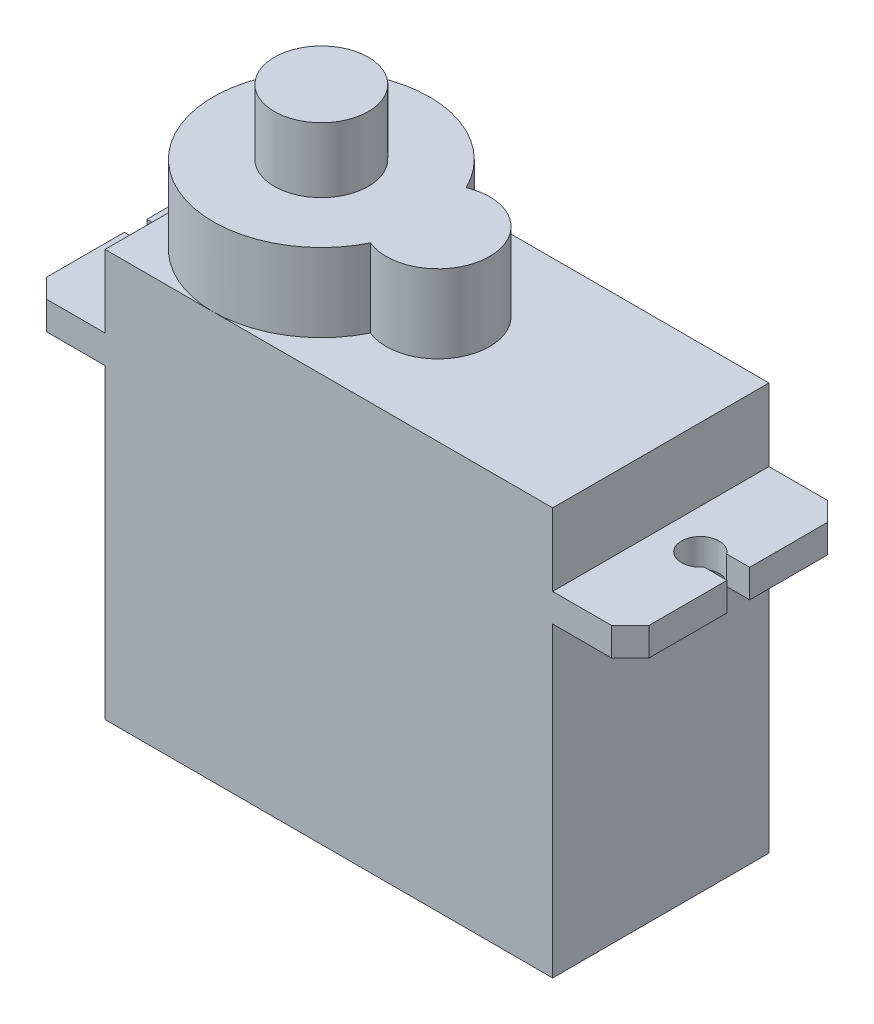
ISO-10303-21;
HEADER;
FILE_DESCRIPTION(('STEP AP214'),'2;1');
FILE_NAME('part.step','',(''),(''),'','','');
FILE_SCHEMA(('AUTOMOTIVE_DESIGN { 1 0 10303 214 1 1 1 1 }'));
ENDSEC;
DATA;
#1=APPLICATION_CONTEXT('core data for automotive mechanical design processes');
#2=APPLICATION_PROTOCOL_DEFINITION('international standard','automotive_design',2000,#1);
#3=PRODUCT_CONTEXT('',#1,'mechanical');
#4=PRODUCT('Part','Part','',(#3));
#5=PRODUCT_RELATED_PRODUCT_CATEGORY('part','',(#4));
#6=PRODUCT_DEFINITION_FORMATION('','',#4);
#7=PRODUCT_DEFINITION_CONTEXT('part definition',#1,'design');
#8=PRODUCT_DEFINITION('design','',#6,#7);
#9=PRODUCT_DEFINITION_SHAPE('','',#8);
#10=(LENGTH_UNIT() NAMED_UNIT(*) SI_UNIT(.MILLI.,.METRE.));
#11=(NAMED_UNIT(*) PLANE_ANGLE_UNIT() SI_UNIT($,.RADIAN.));
#12=(NAMED_UNIT(*) SI_UNIT($,.STERADIAN.) SOLID_ANGLE_UNIT());
#13=UNCERTAINTY_MEASURE_WITH_UNIT(LENGTH_MEASURE(1.E-05),#10,'distance_accuracy_value','');
#14=(GEOMETRIC_REPRESENTATION_CONTEXT(3) GLOBAL_UNCERTAINTY_ASSIGNED_CONTEXT((#13)) GLOBAL_UNIT_ASSIGNED_CONTEXT((#10,
#11,#12)) REPRESENTATION_CONTEXT('',''));
#15=CARTESIAN_POINT('',(0.,0.,0.));
#16=DIRECTION('',(0.,0.,1.));
#17=DIRECTION('',(1.,0.,0.));
#18=AXIS2_PLACEMENT_3D('',#15,#16,#17);
#19=CARTESIAN_POINT('',(-16.025,69.6507342064749,-5.75));
#20=DIRECTION('',(-1.,0.,0.));
#21=DIRECTION('',(0.,0.,1.));
#22=AXIS2_PLACEMENT_3D('',#19,#20,#21);
#23=PLANE('',#22);
#24=DIRECTION('',(0.,0.,-1.));
#25=VECTOR('',#24,1.);
#26=CARTESIAN_POINT('',(-16.025,16.3,-5.75));
#27=LINE('',#26,#25);
#28=CARTESIAN_POINT('',(-16.025,16.3,-0.6));
#29=VERTEX_POINT('',#28);
#30=CARTESIAN_POINT('',(-16.025,16.3,-4.75));
#31=VERTEX_POINT('',#30);
#32=EDGE_CURVE('E313',#29,#31,#27,.T.);
#33=ORIENTED_EDGE('',*,*,#32,.F.);
#34=DIRECTION('',(0.,1.,0.));
#35=VECTOR('',#34,1.);
#36=CARTESIAN_POINT('',(-16.025,-0.001000000000001,-0.6));
#37=LINE('',#36,#35);
#38=CARTESIAN_POINT('',(-16.025,17.8,-0.6));
#39=VERTEX_POINT('',#38);
#40=EDGE_CURVE('E62',#29,#39,#37,.T.);
#41=ORIENTED_EDGE('',*,*,#40,.T.);
#42=DIRECTION('',(0.,0.,1.));
#43=VECTOR('',#42,1.);
#44=CARTESIAN_POINT('',(-16.025,17.8,-5.75));
#45=LINE('',#44,#43);
#46=CARTESIAN_POINT('',(-16.025,17.8,-4.75));
#47=VERTEX_POINT('',#46);
#48=EDGE_CURVE('E345',#47,#39,#45,.T.);
#49=ORIENTED_EDGE('',*,*,#48,.F.);
#50=DIRECTION('',(0.,-1.,0.));
#51=VECTOR('',#50,1.);
#52=CARTESIAN_POINT('',(-16.025,16.3,-4.75));
#53=LINE('',#52,#51);
#54=EDGE_CURVE('E480',#47,#31,#53,.T.);
#55=ORIENTED_EDGE('',*,*,#54,.T.);
#56=EDGE_LOOP('',(#33,#41,#49,#55));
#57=FACE_BOUND('',#56,.T.);
#58=ADVANCED_FACE('F46',(#57),#23,.T.);
#59=CARTESIAN_POINT('',(16.025,69.6507342064749,-5.75));
#60=DIRECTION('',(1.,0.,0.));
#61=DIRECTION('',(0.,0.,-1.));
#62=AXIS2_PLACEMENT_3D('',#59,#60,#61);
#63=PLANE('',#62);
#64=DIRECTION('',(0.,0.,1.));
#65=VECTOR('',#64,1.);
#66=CARTESIAN_POINT('',(16.025,16.3,-5.75));
#67=LINE('',#66,#65);
#68=CARTESIAN_POINT('',(16.025,16.3,0.6));
#69=VERTEX_POINT('',#68);
#70=CARTESIAN_POINT('',(16.025,16.3,4.75));
#71=VERTEX_POINT('',#70);
#72=EDGE_CURVE('E357',#69,#71,#67,.T.);
#73=ORIENTED_EDGE('',*,*,#72,.F.);
#74=DIRECTION('',(0.,1.,0.));
#75=VECTOR('',#74,1.);
#76=CARTESIAN_POINT('',(16.025,-0.001000000000001,0.6));
#77=LINE('',#76,#75);
#78=CARTESIAN_POINT('',(16.025,17.8,0.6));
#79=VERTEX_POINT('',#78);
#80=EDGE_CURVE('E296',#69,#79,#77,.T.);
#81=ORIENTED_EDGE('',*,*,#80,.T.);
#82=DIRECTION('',(0.,0.,-1.));
#83=VECTOR('',#82,1.);
#84=CARTESIAN_POINT('',(16.025,17.8,-5.75));
#85=LINE('',#84,#83);
#86=CARTESIAN_POINT('',(16.025,17.8,4.75));
#87=VERTEX_POINT('',#86);
#88=EDGE_CURVE('E335',#87,#79,#85,.T.);
#89=ORIENTED_EDGE('',*,*,#88,.F.);
#90=DIRECTION('',(0.,-1.,0.));
#91=VECTOR('',#90,1.);
#92=CARTESIAN_POINT('',(16.025,16.3,4.75));
#93=LINE('',#92,#91);
#94=EDGE_CURVE('E455',#87,#71,#93,.T.);
#95=ORIENTED_EDGE('',*,*,#94,.T.);
#96=EDGE_LOOP('',(#73,#81,#89,#95));
#97=FACE_BOUND('',#96,.T.);
#98=ADVANCED_FACE('F591',(#97),#63,.T.);
#99=CARTESIAN_POINT('',(0.,21.65,0.));
#100=DIRECTION('',(0.,-1.,0.));
#101=DIRECTION('',(0.,0.,-1.));
#102=AXIS2_PLACEMENT_3D('',#99,#100,#101);
#103=PLANE('',#102);
#104=CARTESIAN_POINT('',(-6.15,21.65,0.));
#105=DIRECTION('',(0.,1.,0.));
#106=DIRECTION('',(0.,0.,1.));
#107=AXIS2_PLACEMENT_3D('',#104,#105,#106);
#108=CIRCLE('',#107,5.75);
#109=CARTESIAN_POINT('',(-0.993548387096772,21.65,-2.54430870056833));
#110=VERTEX_POINT('',#109);
#111=CARTESIAN_POINT('',(-6.15,21.65,-5.75));
#112=VERTEX_POINT('',#111);
#113=EDGE_CURVE('E308',#110,#112,#108,.T.);
#114=ORIENTED_EDGE('',*,*,#113,.F.);
#115=CARTESIAN_POINT('',(0.0500000000000014,21.65,0.));
#116=DIRECTION('',(0.,1.,0.));
#117=DIRECTION('',(0.,0.,1.));
#118=AXIS2_PLACEMENT_3D('',#115,#116,#117);
#119=CIRCLE('',#118,2.75);
#120=CARTESIAN_POINT('',(-0.993548387096772,21.65,2.54430870056833));
#121=VERTEX_POINT('',#120);
#122=EDGE_CURVE('E318',#121,#110,#119,.T.);
#123=ORIENTED_EDGE('',*,*,#122,.F.);
#124=CARTESIAN_POINT('',(-6.15,21.65,5.75));
#125=VERTEX_POINT('',#124);
#126=EDGE_CURVE('E320',#125,#121,#108,.T.);
#127=ORIENTED_EDGE('',*,*,#126,.F.);
#128=DIRECTION('',(1.,0.,0.));
#129=VECTOR('',#128,1.);
#130=CARTESIAN_POINT('',(-11.9,21.65,5.75));
#131=LINE('',#130,#129);
#132=CARTESIAN_POINT('',(11.9,21.65,5.75));
#133=VERTEX_POINT('',#132);
#134=EDGE_CURVE('E401',#125,#133,#131,.T.);
#135=ORIENTED_EDGE('',*,*,#134,.T.);
#136=DIRECTION('',(0.,0.,-1.));
#137=VECTOR('',#136,1.);
#138=CARTESIAN_POINT('',(11.9,21.65,5.75));
#139=LINE('',#138,#137);
#140=CARTESIAN_POINT('',(11.9,21.65,-5.75));
#141=VERTEX_POINT('',#140);
#142=EDGE_CURVE('E386',#133,#141,#139,.T.);
#143=ORIENTED_EDGE('',*,*,#142,.T.);
#144=DIRECTION('',(-1.,0.,0.));
#145=VECTOR('',#144,1.);
#146=CARTESIAN_POINT('',(-11.9,21.65,-5.75));
#147=LINE('',#146,#145);
#148=EDGE_CURVE('E392',#141,#112,#147,.T.);
#149=ORIENTED_EDGE('',*,*,#148,.T.);
#150=EDGE_LOOP('',(#114,#123,#127,#135,#143,#149));
#151=FACE_BOUND('',#150,.T.);
#152=ADVANCED_FACE('F556',(#151),#103,.F.);
#153=CARTESIAN_POINT('',(-11.9,21.65,0.));
#154=VERTEX_POINT('',#153);
#155=EDGE_CURVE('E319',#112,#154,#108,.T.);
#156=ORIENTED_EDGE('',*,*,#155,.F.);
#157=CARTESIAN_POINT('',(-11.9,21.65,-5.75));
#158=VERTEX_POINT('',#157);
#159=EDGE_CURVE('E390',#112,#158,#147,.T.);
#160=ORIENTED_EDGE('',*,*,#159,.T.);
#161=DIRECTION('',(0.,0.,1.));
#162=VECTOR('',#161,1.);
#163=CARTESIAN_POINT('',(-11.9,21.65,5.75));
#164=LINE('',#163,#162);
#165=EDGE_CURVE('E397',#158,#154,#164,.T.);
#166=ORIENTED_EDGE('',*,*,#165,.T.);
#167=EDGE_LOOP('',(#156,#160,#166));
#168=FACE_BOUND('',#167,.T.);
#169=ADVANCED_FACE('F548',(#168),#103,.F.);
#170=CARTESIAN_POINT('',(11.9,21.65,5.75));
#171=DIRECTION('',(-1.,0.,0.));
#172=DIRECTION('',(0.,0.,1.));
#173=AXIS2_PLACEMENT_3D('',#170,#171,#172);
#174=PLANE('',#173);
#175=DIRECTION('',(0.,0.,1.));
#176=VECTOR('',#175,1.);
#177=CARTESIAN_POINT('',(11.9,17.8,5.75));
#178=LINE('',#177,#176);
#179=CARTESIAN_POINT('',(11.9,17.8,-5.75));
#180=VERTEX_POINT('',#179);
#181=CARTESIAN_POINT('',(11.9,17.8,5.75));
#182=VERTEX_POINT('',#181);
#183=EDGE_CURVE('E373',#180,#182,#178,.T.);
#184=ORIENTED_EDGE('',*,*,#183,.F.);
#185=DIRECTION('',(0.,-1.,0.));
#186=VECTOR('',#185,1.);
#187=CARTESIAN_POINT('',(11.9,21.65,-5.75));
#188=LINE('',#187,#186);
#189=EDGE_CURVE('E434',#141,#180,#188,.T.);
#190=ORIENTED_EDGE('',*,*,#189,.F.);
#191=ORIENTED_EDGE('',*,*,#142,.F.);
#192=DIRECTION('',(0.,-1.,0.));
#193=VECTOR('',#192,1.);
#194=CARTESIAN_POINT('',(11.9,21.65,5.75));
#195=LINE('',#194,#193);
#196=EDGE_CURVE('E421',#133,#182,#195,.T.);
#197=ORIENTED_EDGE('',*,*,#196,.T.);
#198=EDGE_LOOP('',(#184,#190,#191,#197));
#199=FACE_BOUND('',#198,.T.);
#200=ADVANCED_FACE('F563',(#199),#174,.F.);
#201=CARTESIAN_POINT('',(-11.9,21.65,5.75));
#202=DIRECTION('',(1.,0.,0.));
#203=DIRECTION('',(0.,0.,-1.));
#204=AXIS2_PLACEMENT_3D('',#201,#202,#203);
#205=PLANE('',#204);
#206=DIRECTION('',(0.,0.,-1.));
#207=VECTOR('',#206,1.);
#208=CARTESIAN_POINT('',(-11.9,17.8,5.75));
#209=LINE('',#208,#207);
#210=CARTESIAN_POINT('',(-11.9,17.8,5.75));
#211=VERTEX_POINT('',#210);
#212=CARTESIAN_POINT('',(-11.9,17.8,-5.75));
#213=VERTEX_POINT('',#212);
#214=EDGE_CURVE('E369',#211,#213,#209,.T.);
#215=ORIENTED_EDGE('',*,*,#214,.F.);
#216=DIRECTION('',(0.,-1.,0.));
#217=VECTOR('',#216,1.);
#218=CARTESIAN_POINT('',(-11.9,21.65,5.75));
#219=LINE('',#218,#217);
#220=CARTESIAN_POINT('',(-11.9,21.65,5.75));
#221=VERTEX_POINT('',#220);
#222=EDGE_CURVE('E425',#221,#211,#219,.T.);
#223=ORIENTED_EDGE('',*,*,#222,.F.);
#224=EDGE_CURVE('E396',#154,#221,#164,.T.);
#225=ORIENTED_EDGE('',*,*,#224,.F.);
#226=ORIENTED_EDGE('',*,*,#165,.F.);
#227=DIRECTION('',(0.,-1.,0.));
#228=VECTOR('',#227,1.);
#229=CARTESIAN_POINT('',(-11.9,21.65,-5.75));
#230=LINE('',#229,#228);
#231=EDGE_CURVE('E430',#158,#213,#230,.T.);
#232=ORIENTED_EDGE('',*,*,#231,.T.);
#233=EDGE_LOOP('',(#215,#223,#225,#226,#232));
#234=FACE_BOUND('',#233,.T.);
#235=ADVANCED_FACE('F617',(#234),#205,.F.);
#236=CARTESIAN_POINT('',(11.9,16.3,-5.75));
#237=VERTEX_POINT('',#236);
#238=CARTESIAN_POINT('',(11.9,0.,-5.75));
#239=VERTEX_POINT('',#238);
#240=EDGE_CURVE('E433',#237,#239,#188,.T.);
#241=ORIENTED_EDGE('',*,*,#240,.F.);
#242=DIRECTION('',(0.,0.,1.));
#243=VECTOR('',#242,1.);
#244=CARTESIAN_POINT('',(11.9,16.3,5.75));
#245=LINE('',#244,#243);
#246=CARTESIAN_POINT('',(11.9,16.3,5.75));
#247=VERTEX_POINT('',#246);
#248=EDGE_CURVE('E381',#237,#247,#245,.T.);
#249=ORIENTED_EDGE('',*,*,#248,.T.);
#250=CARTESIAN_POINT('',(11.9,0.,5.75));
#251=VERTEX_POINT('',#250);
#252=EDGE_CURVE('E406',#247,#251,#195,.T.);
#253=ORIENTED_EDGE('',*,*,#252,.T.);
#254=DIRECTION('',(0.,0.,-1.));
#255=VECTOR('',#254,1.);
#256=CARTESIAN_POINT('',(11.9,0.,5.75));
#257=LINE('',#256,#255);
#258=EDGE_CURVE('E385',#251,#239,#257,.T.);
#259=ORIENTED_EDGE('',*,*,#258,.T.);
#260=EDGE_LOOP('',(#241,#249,#253,#259));
#261=FACE_BOUND('',#260,.T.);
#262=ADVANCED_FACE('F603',(#261),#174,.F.);
#263=CARTESIAN_POINT('',(-11.9,21.65,-5.75));
#264=DIRECTION('',(0.,0.,1.));
#265=DIRECTION('',(1.,0.,0.));
#266=AXIS2_PLACEMENT_3D('',#263,#264,#265);
#267=PLANE('',#266);
#268=DIRECTION('',(-1.,0.,0.));
#269=VECTOR('',#268,1.);
#270=CARTESIAN_POINT('',(16.025,17.8,-5.75));
#271=LINE('',#270,#269);
#272=CARTESIAN_POINT('',(15.025,17.8,-5.75));
#273=VERTEX_POINT('',#272);
#274=EDGE_CURVE('E366',#273,#180,#271,.T.);
#275=ORIENTED_EDGE('',*,*,#274,.F.);
#276=DIRECTION('',(0.,-1.,0.));
#277=VECTOR('',#276,1.);
#278=CARTESIAN_POINT('',(15.025,16.3,-5.75));
#279=LINE('',#278,#277);
#280=CARTESIAN_POINT('',(15.025,16.3,-5.75));
#281=VERTEX_POINT('',#280);
#282=EDGE_CURVE('E445',#273,#281,#279,.T.);
#283=ORIENTED_EDGE('',*,*,#282,.T.);
#284=DIRECTION('',(1.,0.,0.));
#285=VECTOR('',#284,1.);
#286=CARTESIAN_POINT('',(16.025,16.3,-5.75));
#287=LINE('',#286,#285);
#288=EDGE_CURVE('E353',#237,#281,#287,.T.);
#289=ORIENTED_EDGE('',*,*,#288,.F.);
#290=ORIENTED_EDGE('',*,*,#240,.T.);
#291=DIRECTION('',(-1.,0.,0.));
#292=VECTOR('',#291,1.);
#293=CARTESIAN_POINT('',(-11.9,0.,-5.75));
#294=LINE('',#293,#292);
#295=CARTESIAN_POINT('',(-11.9,0.,-5.75));
#296=VERTEX_POINT('',#295);
#297=EDGE_CURVE('E410',#239,#296,#294,.T.);
#298=ORIENTED_EDGE('',*,*,#297,.T.);
#299=CARTESIAN_POINT('',(-11.9,16.3,-5.75));
#300=VERTEX_POINT('',#299);
#301=EDGE_CURVE('E429',#300,#296,#230,.T.);
#302=ORIENTED_EDGE('',*,*,#301,.F.);
#303=CARTESIAN_POINT('',(-15.025,16.3,-5.75));
#304=VERTEX_POINT('',#303);
#305=EDGE_CURVE('E354',#304,#300,#287,.T.);
#306=ORIENTED_EDGE('',*,*,#305,.F.);
#307=DIRECTION('',(0.,1.,0.));
#308=VECTOR('',#307,1.);
#309=CARTESIAN_POINT('',(-15.025,17.8,-5.75));
#310=LINE('',#309,#308);
#311=CARTESIAN_POINT('',(-15.025,17.8,-5.75));
#312=VERTEX_POINT('',#311);
#313=EDGE_CURVE('E442',#304,#312,#310,.T.);
#314=ORIENTED_EDGE('',*,*,#313,.T.);
#315=EDGE_CURVE('E349',#213,#312,#271,.T.);
#316=ORIENTED_EDGE('',*,*,#315,.F.);
#317=ORIENTED_EDGE('',*,*,#231,.F.);
#318=ORIENTED_EDGE('',*,*,#159,.F.);
#319=ORIENTED_EDGE('',*,*,#148,.F.);
#320=ORIENTED_EDGE('',*,*,#189,.T.);
#321=EDGE_LOOP('',(#275,#283,#289,#290,#298,#302,#306,#314,#316,#317,#318,#319,#320));
#322=FACE_BOUND('',#321,.T.);
#323=ADVANCED_FACE('F553',(#322),#267,.F.);
#324=CARTESIAN_POINT('',(-11.9,16.3,5.75));
#325=VERTEX_POINT('',#324);
#326=CARTESIAN_POINT('',(-11.9,0.,5.75));
#327=VERTEX_POINT('',#326);
#328=EDGE_CURVE('E424',#325,#327,#219,.T.);
#329=ORIENTED_EDGE('',*,*,#328,.F.);
#330=DIRECTION('',(0.,0.,-1.));
#331=VECTOR('',#330,1.);
#332=CARTESIAN_POINT('',(-11.9,16.3,5.75));
#333=LINE('',#332,#331);
#334=EDGE_CURVE('E377',#325,#300,#333,.T.);
#335=ORIENTED_EDGE('',*,*,#334,.T.);
#336=ORIENTED_EDGE('',*,*,#301,.T.);
#337=DIRECTION('',(0.,0.,1.));
#338=VECTOR('',#337,1.);
#339=CARTESIAN_POINT('',(-11.9,0.,5.75));
#340=LINE('',#339,#338);
#341=EDGE_CURVE('E414',#296,#327,#340,.T.);
#342=ORIENTED_EDGE('',*,*,#341,.T.);
#343=EDGE_LOOP('',(#329,#335,#336,#342));
#344=FACE_BOUND('',#343,.T.);
#345=ADVANCED_FACE('F610',(#344),#205,.F.);
#346=CARTESIAN_POINT('',(-11.9,21.65,5.75));
#347=DIRECTION('',(0.,0.,-1.));
#348=DIRECTION('',(-1.,0.,0.));
#349=AXIS2_PLACEMENT_3D('',#346,#347,#348);
#350=PLANE('',#349);
#351=DIRECTION('',(-1.,0.,0.));
#352=VECTOR('',#351,1.);
#353=CARTESIAN_POINT('',(16.025,16.3,5.75));
#354=LINE('',#353,#352);
#355=CARTESIAN_POINT('',(15.025,16.3,5.75));
#356=VERTEX_POINT('',#355);
#357=EDGE_CURVE('E363',#356,#247,#354,.T.);
#358=ORIENTED_EDGE('',*,*,#357,.F.);
#359=DIRECTION('',(0.,1.,0.));
#360=VECTOR('',#359,1.);
#361=CARTESIAN_POINT('',(15.025,17.8,5.75));
#362=LINE('',#361,#360);
#363=CARTESIAN_POINT('',(15.025,17.8,5.75));
#364=VERTEX_POINT('',#363);
#365=EDGE_CURVE('E473',#356,#364,#362,.T.);
#366=ORIENTED_EDGE('',*,*,#365,.T.);
#367=DIRECTION('',(1.,0.,0.));
#368=VECTOR('',#367,1.);
#369=CARTESIAN_POINT('',(16.025,17.8,5.75));
#370=LINE('',#369,#368);
#371=EDGE_CURVE('E339',#182,#364,#370,.T.);
#372=ORIENTED_EDGE('',*,*,#371,.F.);
#373=ORIENTED_EDGE('',*,*,#196,.F.);
#374=ORIENTED_EDGE('',*,*,#134,.F.);
#375=EDGE_CURVE('E402',#221,#125,#131,.T.);
#376=ORIENTED_EDGE('',*,*,#375,.F.);
#377=ORIENTED_EDGE('',*,*,#222,.T.);
#378=CARTESIAN_POINT('',(-15.025,17.8,5.75));
#379=VERTEX_POINT('',#378);
#380=EDGE_CURVE('E341',#379,#211,#370,.T.);
#381=ORIENTED_EDGE('',*,*,#380,.F.);
#382=DIRECTION('',(0.,-1.,0.));
#383=VECTOR('',#382,1.);
#384=CARTESIAN_POINT('',(-15.025,16.3,5.75));
#385=LINE('',#384,#383);
#386=CARTESIAN_POINT('',(-15.025,16.3,5.75));
#387=VERTEX_POINT('',#386);
#388=EDGE_CURVE('E469',#379,#387,#385,.T.);
#389=ORIENTED_EDGE('',*,*,#388,.T.);
#390=EDGE_CURVE('E362',#325,#387,#354,.T.);
#391=ORIENTED_EDGE('',*,*,#390,.F.);
#392=ORIENTED_EDGE('',*,*,#328,.T.);
#393=DIRECTION('',(1.,0.,0.));
#394=VECTOR('',#393,1.);
#395=CARTESIAN_POINT('',(-11.9,0.,5.75));
#396=LINE('',#395,#394);
#397=EDGE_CURVE('E391',#327,#251,#396,.T.);
#398=ORIENTED_EDGE('',*,*,#397,.T.);
#399=ORIENTED_EDGE('',*,*,#252,.F.);
#400=EDGE_LOOP('',(#358,#366,#372,#373,#374,#376,#377,#381,#389,#391,#392,#398,#399));
#401=FACE_BOUND('',#400,.T.);
#402=ADVANCED_FACE('F502',(#401),#350,.F.);
#403=EDGE_CURVE('E539',#154,#125,#108,.T.);
#404=ORIENTED_EDGE('',*,*,#403,.F.);
#405=ORIENTED_EDGE('',*,*,#224,.T.);
#406=ORIENTED_EDGE('',*,*,#375,.T.);
#407=EDGE_LOOP('',(#404,#405,#406));
#408=FACE_BOUND('',#407,.T.);
#409=ADVANCED_FACE('F620',(#408),#103,.F.);
#410=CARTESIAN_POINT('',(0.,0.,0.));
#411=DIRECTION('',(0.,-1.,0.));
#412=DIRECTION('',(0.,0.,-1.));
#413=AXIS2_PLACEMENT_3D('',#410,#411,#412);
#414=PLANE('',#413);
#415=ORIENTED_EDGE('',*,*,#258,.F.);
#416=ORIENTED_EDGE('',*,*,#397,.F.);
#417=ORIENTED_EDGE('',*,*,#341,.F.);
#418=ORIENTED_EDGE('',*,*,#297,.F.);
#419=EDGE_LOOP('',(#415,#416,#417,#418));
#420=FACE_BOUND('',#419,.T.);
#421=ADVANCED_FACE('F608',(#420),#414,.T.);
#422=DIRECTION('',(0.,1.,0.));
#423=VECTOR('',#422,1.);
#424=CARTESIAN_POINT('',(-16.025,-0.001000000000001,0.6));
#425=LINE('',#424,#423);
#426=CARTESIAN_POINT('',(-16.025,16.3,0.6));
#427=VERTEX_POINT('',#426);
#428=CARTESIAN_POINT('',(-16.025,17.8,0.6));
#429=VERTEX_POINT('',#428);
#430=EDGE_CURVE('E266',#427,#429,#425,.T.);
#431=ORIENTED_EDGE('',*,*,#430,.F.);
#432=CARTESIAN_POINT('',(-16.025,16.3,4.74999999999999));
#433=VERTEX_POINT('',#432);
#434=EDGE_CURVE('E350',#433,#427,#27,.T.);
#435=ORIENTED_EDGE('',*,*,#434,.F.);
#436=DIRECTION('',(0.,1.,0.));
#437=VECTOR('',#436,1.);
#438=CARTESIAN_POINT('',(-16.025,17.8,4.74999999999999));
#439=LINE('',#438,#437);
#440=CARTESIAN_POINT('',(-16.025,17.8,4.74999999999999));
#441=VERTEX_POINT('',#440);
#442=EDGE_CURVE('E476',#433,#441,#439,.T.);
#443=ORIENTED_EDGE('',*,*,#442,.T.);
#444=EDGE_CURVE('E344',#429,#441,#45,.T.);
#445=ORIENTED_EDGE('',*,*,#444,.F.);
#446=EDGE_LOOP('',(#431,#435,#443,#445));
#447=FACE_BOUND('',#446,.T.);
#448=ADVANCED_FACE('F511',(#447),#23,.T.);
#449=CARTESIAN_POINT('',(0.,17.8,0.));
#450=DIRECTION('',(0.,-1.,0.));
#451=DIRECTION('',(0.,0.,-1.));
#452=AXIS2_PLACEMENT_3D('',#449,#450,#451);
#453=PLANE('',#452);
#454=CARTESIAN_POINT('',(-14.,17.8,0.));
#455=DIRECTION('',(0.,-1.,0.));
#456=DIRECTION('',(0.,0.,1.));
#457=AXIS2_PLACEMENT_3D('',#454,#455,#456);
#458=CIRCLE('',#457,1.);
#459=CARTESIAN_POINT('',(-14.8,17.8,-0.6));
#460=VERTEX_POINT('',#459);
#461=CARTESIAN_POINT('',(-14.8,17.8,0.600000000000001));
#462=VERTEX_POINT('',#461);
#463=EDGE_CURVE('E235',#460,#462,#458,.T.);
#464=ORIENTED_EDGE('',*,*,#463,.T.);
#465=DIRECTION('',(1.,0.,0.));
#466=VECTOR('',#465,1.);
#467=CARTESIAN_POINT('',(0.,17.8,0.600000000000001));
#468=LINE('',#467,#466);
#469=EDGE_CURVE('E238',#429,#462,#468,.T.);
#470=ORIENTED_EDGE('',*,*,#469,.F.);
#471=ORIENTED_EDGE('',*,*,#444,.T.);
#472=DIRECTION('',(0.707106781186548,0.,0.707106781186547));
#473=VECTOR('',#472,1.);
#474=CARTESIAN_POINT('',(-15.025,17.8,5.75));
#475=LINE('',#474,#473);
#476=EDGE_CURVE('E55',#441,#379,#475,.T.);
#477=ORIENTED_EDGE('',*,*,#476,.T.);
#478=ORIENTED_EDGE('',*,*,#380,.T.);
#479=ORIENTED_EDGE('',*,*,#214,.T.);
#480=ORIENTED_EDGE('',*,*,#315,.T.);
#481=DIRECTION('',(-0.707106781186548,0.,0.707106781186547));
#482=VECTOR('',#481,1.);
#483=CARTESIAN_POINT('',(-16.025,17.8,-4.75));
#484=LINE('',#483,#482);
#485=EDGE_CURVE('E12',#312,#47,#484,.T.);
#486=ORIENTED_EDGE('',*,*,#485,.T.);
#487=ORIENTED_EDGE('',*,*,#48,.T.);
#488=DIRECTION('',(1.,0.,0.));
#489=VECTOR('',#488,1.);
#490=CARTESIAN_POINT('',(0.,17.8,-0.599999999999999));
#491=LINE('',#490,#489);
#492=EDGE_CURVE('E258',#39,#460,#491,.T.);
#493=ORIENTED_EDGE('',*,*,#492,.T.);
#494=EDGE_LOOP('',(#464,#470,#471,#477,#478,#479,#480,#486,#487,#493));
#495=FACE_BOUND('',#494,.T.);
#496=ADVANCED_FACE('F493',(#495),#453,.F.);
#497=CARTESIAN_POINT('',(0.,16.3,0.));
#498=DIRECTION('',(0.,-1.,0.));
#499=DIRECTION('',(0.,0.,-1.));
#500=AXIS2_PLACEMENT_3D('',#497,#498,#499);
#501=PLANE('',#500);
#502=DIRECTION('',(1.,0.,0.));
#503=VECTOR('',#502,1.);
#504=CARTESIAN_POINT('',(0.,16.3,0.600000000000001));
#505=LINE('',#504,#503);
#506=CARTESIAN_POINT('',(-14.8,16.3,0.600000000000001));
#507=VERTEX_POINT('',#506);
#508=EDGE_CURVE('E250',#427,#507,#505,.T.);
#509=ORIENTED_EDGE('',*,*,#508,.T.);
#510=CARTESIAN_POINT('',(-14.,16.3,0.));
#511=DIRECTION('',(0.,-1.,0.));
#512=DIRECTION('',(0.,0.,-1.));
#513=AXIS2_PLACEMENT_3D('',#510,#511,#512);
#514=CIRCLE('',#513,1.);
#515=CARTESIAN_POINT('',(-14.8,16.3,-0.6));
#516=VERTEX_POINT('',#515);
#517=EDGE_CURVE('E232',#516,#507,#514,.T.);
#518=ORIENTED_EDGE('',*,*,#517,.F.);
#519=DIRECTION('',(1.,0.,0.));
#520=VECTOR('',#519,1.);
#521=CARTESIAN_POINT('',(0.,16.3,-0.599999999999999));
#522=LINE('',#521,#520);
#523=EDGE_CURVE('E240',#29,#516,#522,.T.);
#524=ORIENTED_EDGE('',*,*,#523,.F.);
#525=ORIENTED_EDGE('',*,*,#32,.T.);
#526=DIRECTION('',(0.707106781186548,0.,-0.707106781186547));
#527=VECTOR('',#526,1.);
#528=CARTESIAN_POINT('',(-10.3875,16.3,-10.3875));
#529=LINE('',#528,#527);
#530=EDGE_CURVE('E487',#31,#304,#529,.T.);
#531=ORIENTED_EDGE('',*,*,#530,.T.);
#532=ORIENTED_EDGE('',*,*,#305,.T.);
#533=ORIENTED_EDGE('',*,*,#334,.F.);
#534=ORIENTED_EDGE('',*,*,#390,.T.);
#535=DIRECTION('',(-0.707106781186548,0.,-0.707106781186547));
#536=VECTOR('',#535,1.);
#537=CARTESIAN_POINT('',(-10.3875,16.3,10.3875));
#538=LINE('',#537,#536);
#539=EDGE_CURVE('E484',#387,#433,#538,.T.);
#540=ORIENTED_EDGE('',*,*,#539,.T.);
#541=ORIENTED_EDGE('',*,*,#434,.T.);
#542=EDGE_LOOP('',(#509,#518,#524,#525,#531,#532,#533,#534,#540,#541));
#543=FACE_BOUND('',#542,.T.);
#544=ADVANCED_FACE('F248',(#543),#501,.T.);
#545=DIRECTION('',(-1.,0.,0.));
#546=VECTOR('',#545,1.);
#547=CARTESIAN_POINT('',(0.,16.3,-0.599999999999999));
#548=LINE('',#547,#546);
#549=CARTESIAN_POINT('',(16.025,16.3,-0.6));
#550=VERTEX_POINT('',#549);
#551=CARTESIAN_POINT('',(14.8,16.3,-0.6));
#552=VERTEX_POINT('',#551);
#553=EDGE_CURVE('E274',#550,#552,#548,.T.);
#554=ORIENTED_EDGE('',*,*,#553,.T.);
#555=CARTESIAN_POINT('',(14.,16.3,0.));
#556=DIRECTION('',(0.,-1.,0.));
#557=DIRECTION('',(0.,0.,-1.));
#558=AXIS2_PLACEMENT_3D('',#555,#556,#557);
#559=CIRCLE('',#558,1.);
#560=CARTESIAN_POINT('',(14.8,16.3,0.6));
#561=VERTEX_POINT('',#560);
#562=EDGE_CURVE('E245',#552,#561,#559,.F.);
#563=ORIENTED_EDGE('',*,*,#562,.T.);
#564=DIRECTION('',(-1.,0.,0.));
#565=VECTOR('',#564,1.);
#566=CARTESIAN_POINT('',(0.,16.3,0.600000000000001));
#567=LINE('',#566,#565);
#568=EDGE_CURVE('E292',#69,#561,#567,.T.);
#569=ORIENTED_EDGE('',*,*,#568,.F.);
#570=ORIENTED_EDGE('',*,*,#72,.T.);
#571=DIRECTION('',(-0.707106781186548,0.,0.707106781186547));
#572=VECTOR('',#571,1.);
#573=CARTESIAN_POINT('',(10.3875,16.3,10.3875));
#574=LINE('',#573,#572);
#575=EDGE_CURVE('E449',#71,#356,#574,.T.);
#576=ORIENTED_EDGE('',*,*,#575,.T.);
#577=ORIENTED_EDGE('',*,*,#357,.T.);
#578=ORIENTED_EDGE('',*,*,#248,.F.);
#579=ORIENTED_EDGE('',*,*,#288,.T.);
#580=DIRECTION('',(0.707106781186548,0.,0.707106781186547));
#581=VECTOR('',#580,1.);
#582=CARTESIAN_POINT('',(10.3875,16.3,-10.3875));
#583=LINE('',#582,#581);
#584=CARTESIAN_POINT('',(16.025,16.3,-4.74999999999999));
#585=VERTEX_POINT('',#584);
#586=EDGE_CURVE('E452',#281,#585,#583,.T.);
#587=ORIENTED_EDGE('',*,*,#586,.T.);
#588=EDGE_CURVE('E358',#585,#550,#67,.T.);
#589=ORIENTED_EDGE('',*,*,#588,.T.);
#590=EDGE_LOOP('',(#554,#563,#569,#570,#576,#577,#578,#579,#587,#589));
#591=FACE_BOUND('',#590,.T.);
#592=ADVANCED_FACE('F573',(#591),#501,.T.);
#593=CARTESIAN_POINT('',(14.,17.8,0.));
#594=DIRECTION('',(0.,1.,0.));
#595=DIRECTION('',(0.,0.,1.));
#596=AXIS2_PLACEMENT_3D('',#593,#594,#595);
#597=CIRCLE('',#596,1.);
#598=CARTESIAN_POINT('',(14.8,17.8,-0.6));
#599=VERTEX_POINT('',#598);
#600=CARTESIAN_POINT('',(14.8,17.8,0.600000000000001));
#601=VERTEX_POINT('',#600);
#602=EDGE_CURVE('E278',#599,#601,#597,.T.);
#603=ORIENTED_EDGE('',*,*,#602,.F.);
#604=DIRECTION('',(-1.,0.,0.));
#605=VECTOR('',#604,1.);
#606=CARTESIAN_POINT('',(0.,17.8,-0.599999999999999));
#607=LINE('',#606,#605);
#608=CARTESIAN_POINT('',(16.025,17.8,-0.6));
#609=VERTEX_POINT('',#608);
#610=EDGE_CURVE('E284',#609,#599,#607,.T.);
#611=ORIENTED_EDGE('',*,*,#610,.F.);
#612=CARTESIAN_POINT('',(16.025,17.8,-4.74999999999999));
#613=VERTEX_POINT('',#612);
#614=EDGE_CURVE('E340',#609,#613,#85,.T.);
#615=ORIENTED_EDGE('',*,*,#614,.T.);
#616=DIRECTION('',(-0.707106781186548,0.,-0.707106781186547));
#617=VECTOR('',#616,1.);
#618=CARTESIAN_POINT('',(15.025,17.8,-5.75));
#619=LINE('',#618,#617);
#620=EDGE_CURVE('E466',#613,#273,#619,.T.);
#621=ORIENTED_EDGE('',*,*,#620,.T.);
#622=ORIENTED_EDGE('',*,*,#274,.T.);
#623=ORIENTED_EDGE('',*,*,#183,.T.);
#624=ORIENTED_EDGE('',*,*,#371,.T.);
#625=DIRECTION('',(0.707106781186548,0.,-0.707106781186547));
#626=VECTOR('',#625,1.);
#627=CARTESIAN_POINT('',(16.025,17.8,4.75));
#628=LINE('',#627,#626);
#629=EDGE_CURVE('E463',#364,#87,#628,.T.);
#630=ORIENTED_EDGE('',*,*,#629,.T.);
#631=ORIENTED_EDGE('',*,*,#88,.T.);
#632=DIRECTION('',(-1.,0.,0.));
#633=VECTOR('',#632,1.);
#634=CARTESIAN_POINT('',(0.,17.8,0.600000000000001));
#635=LINE('',#634,#633);
#636=EDGE_CURVE('E70',#79,#601,#635,.T.);
#637=ORIENTED_EDGE('',*,*,#636,.T.);
#638=EDGE_LOOP('',(#603,#611,#615,#621,#622,#623,#624,#630,#631,#637));
#639=FACE_BOUND('',#638,.T.);
#640=ADVANCED_FACE('F583',(#639),#453,.F.);
#641=DIRECTION('',(0.,1.,0.));
#642=VECTOR('',#641,1.);
#643=CARTESIAN_POINT('',(16.025,-0.001000000000001,-0.6));
#644=LINE('',#643,#642);
#645=EDGE_CURVE('E293',#550,#609,#644,.T.);
#646=ORIENTED_EDGE('',*,*,#645,.F.);
#647=ORIENTED_EDGE('',*,*,#588,.F.);
#648=DIRECTION('',(0.,1.,0.));
#649=VECTOR('',#648,1.);
#650=CARTESIAN_POINT('',(16.025,17.8,-4.74999999999999));
#651=LINE('',#650,#649);
#652=EDGE_CURVE('E459',#585,#613,#651,.T.);
#653=ORIENTED_EDGE('',*,*,#652,.T.);
#654=ORIENTED_EDGE('',*,*,#614,.F.);
#655=EDGE_LOOP('',(#646,#647,#653,#654));
#656=FACE_BOUND('',#655,.T.);
#657=ADVANCED_FACE('F577',(#656),#63,.T.);
#658=CARTESIAN_POINT('',(0.0500000000000014,70.2638688379446,0.));
#659=DIRECTION('',(0.,-1.,0.));
#660=DIRECTION('',(0.,0.,-1.));
#661=AXIS2_PLACEMENT_3D('',#658,#659,#660);
#662=CYLINDRICAL_SURFACE('',#661,2.75);
#663=DIRECTION('',(0.,-1.,0.));
#664=VECTOR('',#663,1.);
#665=CARTESIAN_POINT('',(-0.993548387096772,70.2638688379446,-2.54430870056833));
#666=LINE('',#665,#664);
#667=CARTESIAN_POINT('',(-0.993548387096772,25.8,-2.54430870056833));
#668=VERTEX_POINT('',#667);
#669=EDGE_CURVE('E324',#668,#110,#666,.T.);
#670=ORIENTED_EDGE('',*,*,#669,.F.);
#671=CARTESIAN_POINT('',(0.0500000000000014,25.8,0.));
#672=DIRECTION('',(0.,-1.,0.));
#673=DIRECTION('',(0.,0.,-1.));
#674=AXIS2_PLACEMENT_3D('',#671,#672,#673);
#675=CIRCLE('',#674,2.75);
#676=CARTESIAN_POINT('',(-0.993548387096772,25.8,2.54430870056833));
#677=VERTEX_POINT('',#676);
#678=EDGE_CURVE('E314',#668,#677,#675,.T.);
#679=ORIENTED_EDGE('',*,*,#678,.T.);
#680=DIRECTION('',(0.,-1.,0.));
#681=VECTOR('',#680,1.);
#682=CARTESIAN_POINT('',(-0.993548387096772,70.2638688379446,2.54430870056833));
#683=LINE('',#682,#681);
#684=EDGE_CURVE('E328',#677,#121,#683,.T.);
#685=ORIENTED_EDGE('',*,*,#684,.T.);
#686=ORIENTED_EDGE('',*,*,#122,.T.);
#687=EDGE_LOOP('',(#670,#679,#685,#686));
#688=FACE_BOUND('',#687,.T.);
#689=ADVANCED_FACE('F652',(#688),#662,.T.);
#690=CARTESIAN_POINT('',(-6.15,70.2638688379446,0.));
#691=DIRECTION('',(0.,-1.,0.));
#692=DIRECTION('',(0.,0.,-1.));
#693=AXIS2_PLACEMENT_3D('',#690,#691,#692);
#694=CYLINDRICAL_SURFACE('',#693,5.75);
#695=ORIENTED_EDGE('',*,*,#684,.F.);
#696=CARTESIAN_POINT('',(-6.15,25.8,0.));
#697=DIRECTION('',(0.,-1.,0.));
#698=DIRECTION('',(0.,0.,-1.));
#699=AXIS2_PLACEMENT_3D('',#696,#697,#698);
#700=CIRCLE('',#699,5.75);
#701=EDGE_CURVE('E309',#677,#668,#700,.T.);
#702=ORIENTED_EDGE('',*,*,#701,.T.);
#703=ORIENTED_EDGE('',*,*,#669,.T.);
#704=ORIENTED_EDGE('',*,*,#113,.T.);
#705=ORIENTED_EDGE('',*,*,#155,.T.);
#706=ORIENTED_EDGE('',*,*,#403,.T.);
#707=ORIENTED_EDGE('',*,*,#126,.T.);
#708=EDGE_LOOP('',(#695,#702,#703,#704,#705,#706,#707));
#709=FACE_BOUND('',#708,.T.);
#710=ADVANCED_FACE('F545',(#709),#694,.T.);
#711=CARTESIAN_POINT('',(0.,25.8,0.));
#712=DIRECTION('',(0.,-1.,0.));
#713=DIRECTION('',(0.,0.,-1.));
#714=AXIS2_PLACEMENT_3D('',#711,#712,#713);
#715=PLANE('',#714);
#716=CARTESIAN_POINT('',(-6.15,25.8,0.));
#717=DIRECTION('',(0.,-1.,0.));
#718=DIRECTION('',(0.,0.,-1.));
#719=AXIS2_PLACEMENT_3D('',#716,#717,#718);
#720=CIRCLE('',#719,2.5);
#721=CARTESIAN_POINT('',(-6.15,25.8,-2.5));
#722=VERTEX_POINT('',#721);
#723=EDGE_CURVE('E438',#722,#722,#720,.F.);
#724=ORIENTED_EDGE('',*,*,#723,.F.);
#725=EDGE_LOOP('',(#724));
#726=FACE_BOUND('',#725,.T.);
#727=ORIENTED_EDGE('',*,*,#678,.F.);
#728=ORIENTED_EDGE('',*,*,#701,.F.);
#729=EDGE_LOOP('',(#727,#728));
#730=FACE_BOUND('',#729,.T.);
#731=ADVANCED_FACE('F780',(#726,#730),#715,.F.);
#732=CARTESIAN_POINT('',(-6.15,65.5710678118655,0.));
#733=DIRECTION('',(0.,-1.,0.));
#734=DIRECTION('',(0.,0.,-1.));
#735=AXIS2_PLACEMENT_3D('',#732,#733,#734);
#736=CYLINDRICAL_SURFACE('',#735,2.5);
#737=CARTESIAN_POINT('',(-6.15,29.25,0.));
#738=DIRECTION('',(0.,-1.,0.));
#739=DIRECTION('',(0.,0.,-1.));
#740=AXIS2_PLACEMENT_3D('',#737,#738,#739);
#741=CIRCLE('',#740,2.5);
#742=CARTESIAN_POINT('',(-6.15,29.25,-2.5));
#743=VERTEX_POINT('',#742);
#744=EDGE_CURVE('E304',#743,#743,#741,.T.);
#745=ORIENTED_EDGE('',*,*,#744,.T.);
#746=EDGE_LOOP('',(#745));
#747=FACE_BOUND('',#746,.T.);
#748=ORIENTED_EDGE('',*,*,#723,.T.);
#749=EDGE_LOOP('',(#748));
#750=FACE_BOUND('',#749,.T.);
#751=ADVANCED_FACE('F770',(#747,#750),#736,.T.);
#752=CARTESIAN_POINT('',(0.,29.25,0.));
#753=DIRECTION('',(0.,-1.,0.));
#754=DIRECTION('',(0.,0.,-1.));
#755=AXIS2_PLACEMENT_3D('',#752,#753,#754);
#756=PLANE('',#755);
#757=ORIENTED_EDGE('',*,*,#744,.F.);
#758=EDGE_LOOP('',(#757));
#759=FACE_BOUND('',#758,.T.);
#760=ADVANCED_FACE('F761',(#759),#756,.F.);
#761=CARTESIAN_POINT('',(15.025,21.65,-5.75));
#762=DIRECTION('',(0.707106781186546,0.,-0.707106781186548));
#763=DIRECTION('',(0.,1.,0.));
#764=AXIS2_PLACEMENT_3D('',#761,#762,#763);
#765=PLANE('',#764);
#766=ORIENTED_EDGE('',*,*,#620,.F.);
#767=ORIENTED_EDGE('',*,*,#652,.F.);
#768=ORIENTED_EDGE('',*,*,#586,.F.);
#769=ORIENTED_EDGE('',*,*,#282,.F.);
#770=EDGE_LOOP('',(#766,#767,#768,#769));
#771=FACE_BOUND('',#770,.T.);
#772=ADVANCED_FACE('F569',(#771),#765,.T.);
#773=CARTESIAN_POINT('',(16.025,69.6507342064749,4.75));
#774=DIRECTION('',(0.707106781186547,0.,0.707106781186548));
#775=DIRECTION('',(0.,1.,0.));
#776=AXIS2_PLACEMENT_3D('',#773,#774,#775);
#777=PLANE('',#776);
#778=ORIENTED_EDGE('',*,*,#629,.F.);
#779=ORIENTED_EDGE('',*,*,#365,.F.);
#780=ORIENTED_EDGE('',*,*,#575,.F.);
#781=ORIENTED_EDGE('',*,*,#94,.F.);
#782=EDGE_LOOP('',(#778,#779,#780,#781));
#783=FACE_BOUND('',#782,.T.);
#784=ADVANCED_FACE('F596',(#783),#777,.T.);
#785=CARTESIAN_POINT('',(-16.025,69.6507342064749,-4.75));
#786=DIRECTION('',(-0.707106781186547,0.,-0.707106781186548));
#787=DIRECTION('',(0.,1.,0.));
#788=AXIS2_PLACEMENT_3D('',#785,#786,#787);
#789=PLANE('',#788);
#790=ORIENTED_EDGE('',*,*,#485,.F.);
#791=ORIENTED_EDGE('',*,*,#313,.F.);
#792=ORIENTED_EDGE('',*,*,#530,.F.);
#793=ORIENTED_EDGE('',*,*,#54,.F.);
#794=EDGE_LOOP('',(#790,#791,#792,#793));
#795=FACE_BOUND('',#794,.T.);
#796=ADVANCED_FACE('F615',(#795),#789,.T.);
#797=CARTESIAN_POINT('',(-15.025,21.65,5.75));
#798=DIRECTION('',(-0.707106781186547,0.,0.707106781186548));
#799=DIRECTION('',(0.,1.,0.));
#800=AXIS2_PLACEMENT_3D('',#797,#798,#799);
#801=PLANE('',#800);
#802=ORIENTED_EDGE('',*,*,#476,.F.);
#803=ORIENTED_EDGE('',*,*,#442,.F.);
#804=ORIENTED_EDGE('',*,*,#539,.F.);
#805=ORIENTED_EDGE('',*,*,#388,.F.);
#806=EDGE_LOOP('',(#802,#803,#804,#805));
#807=FACE_BOUND('',#806,.T.);
#808=ADVANCED_FACE('F48',(#807),#801,.T.);
#809=CARTESIAN_POINT('',(14.,-0.001000000000001,0.));
#810=DIRECTION('',(0.,1.,0.));
#811=DIRECTION('',(0.,0.,1.));
#812=AXIS2_PLACEMENT_3D('',#809,#810,#811);
#813=CYLINDRICAL_SURFACE('',#812,1.);
#814=DIRECTION('',(0.,1.,0.));
#815=VECTOR('',#814,1.);
#816=CARTESIAN_POINT('',(14.8,-0.001000000000001,-0.6));
#817=LINE('',#816,#815);
#818=EDGE_CURVE('E289',#552,#599,#817,.T.);
#819=ORIENTED_EDGE('',*,*,#818,.T.);
#820=ORIENTED_EDGE('',*,*,#602,.T.);
#821=DIRECTION('',(0.,1.,0.));
#822=VECTOR('',#821,1.);
#823=CARTESIAN_POINT('',(14.8,-0.001000000000001,0.600000000000001));
#824=LINE('',#823,#822);
#825=EDGE_CURVE('E288',#561,#601,#824,.T.);
#826=ORIENTED_EDGE('',*,*,#825,.F.);
#827=ORIENTED_EDGE('',*,*,#562,.F.);
#828=EDGE_LOOP('',(#819,#820,#826,#827));
#829=FACE_BOUND('',#828,.T.);
#830=ADVANCED_FACE('F585',(#829),#813,.F.);
#831=CARTESIAN_POINT('',(0.,-0.001000000000001,-0.599999999999999));
#832=DIRECTION('',(0.,0.,-1.));
#833=DIRECTION('',(-1.,0.,0.));
#834=AXIS2_PLACEMENT_3D('',#831,#832,#833);
#835=PLANE('',#834);
#836=ORIENTED_EDGE('',*,*,#645,.T.);
#837=ORIENTED_EDGE('',*,*,#610,.T.);
#838=ORIENTED_EDGE('',*,*,#818,.F.);
#839=ORIENTED_EDGE('',*,*,#553,.F.);
#840=EDGE_LOOP('',(#836,#837,#838,#839));
#841=FACE_BOUND('',#840,.T.);
#842=ADVANCED_FACE('F581',(#841),#835,.F.);
#843=CARTESIAN_POINT('',(0.,-0.001000000000001,0.600000000000001));
#844=DIRECTION('',(0.,0.,-1.));
#845=DIRECTION('',(-1.,0.,0.));
#846=AXIS2_PLACEMENT_3D('',#843,#844,#845);
#847=PLANE('',#846);
#848=ORIENTED_EDGE('',*,*,#568,.T.);
#849=ORIENTED_EDGE('',*,*,#825,.T.);
#850=ORIENTED_EDGE('',*,*,#636,.F.);
#851=ORIENTED_EDGE('',*,*,#80,.F.);
#852=EDGE_LOOP('',(#848,#849,#850,#851));
#853=FACE_BOUND('',#852,.T.);
#854=ADVANCED_FACE('F672',(#853),#847,.T.);
#855=CARTESIAN_POINT('',(-14.,-0.001000000000001,0.));
#856=DIRECTION('',(0.,1.,0.));
#857=DIRECTION('',(0.,0.,1.));
#858=AXIS2_PLACEMENT_3D('',#855,#856,#857);
#859=CYLINDRICAL_SURFACE('',#858,1.);
#860=ORIENTED_EDGE('',*,*,#517,.T.);
#861=DIRECTION('',(0.,1.,0.));
#862=VECTOR('',#861,1.);
#863=CARTESIAN_POINT('',(-14.8,-0.001000000000001,0.600000000000001));
#864=LINE('',#863,#862);
#865=EDGE_CURVE('E246',#507,#462,#864,.T.);
#866=ORIENTED_EDGE('',*,*,#865,.T.);
#867=ORIENTED_EDGE('',*,*,#463,.F.);
#868=DIRECTION('',(0.,1.,0.));
#869=VECTOR('',#868,1.);
#870=CARTESIAN_POINT('',(-14.8,-0.001000000000001,-0.6));
#871=LINE('',#870,#869);
#872=EDGE_CURVE('E229',#516,#460,#871,.T.);
#873=ORIENTED_EDGE('',*,*,#872,.F.);
#874=EDGE_LOOP('',(#860,#866,#867,#873));
#875=FACE_BOUND('',#874,.T.);
#876=ADVANCED_FACE('F230',(#875),#859,.F.);
#877=CARTESIAN_POINT('',(0.,-0.001000000000001,0.600000000000001));
#878=DIRECTION('',(0.,0.,1.));
#879=DIRECTION('',(1.,0.,0.));
#880=AXIS2_PLACEMENT_3D('',#877,#878,#879);
#881=PLANE('',#880);
#882=ORIENTED_EDGE('',*,*,#430,.T.);
#883=ORIENTED_EDGE('',*,*,#469,.T.);
#884=ORIENTED_EDGE('',*,*,#865,.F.);
#885=ORIENTED_EDGE('',*,*,#508,.F.);
#886=EDGE_LOOP('',(#882,#883,#884,#885));
#887=FACE_BOUND('',#886,.T.);
#888=ADVANCED_FACE('F513',(#887),#881,.F.);
#889=CARTESIAN_POINT('',(0.,-0.001000000000001,-0.599999999999999));
#890=DIRECTION('',(0.,0.,1.));
#891=DIRECTION('',(1.,0.,0.));
#892=AXIS2_PLACEMENT_3D('',#889,#890,#891);
#893=PLANE('',#892);
#894=ORIENTED_EDGE('',*,*,#523,.T.);
#895=ORIENTED_EDGE('',*,*,#872,.T.);
#896=ORIENTED_EDGE('',*,*,#492,.F.);
#897=ORIENTED_EDGE('',*,*,#40,.F.);
#898=EDGE_LOOP('',(#894,#895,#896,#897));
#899=FACE_BOUND('',#898,.T.);
#900=ADVANCED_FACE('F241',(#899),#893,.T.);
#901=CLOSED_SHELL('',(#58,#98,#152,#169,#200,#235,#262,#323,#345,#402,#409,#421,#448,#496,#544,
#592,#640,#657,#689,#710,#731,#751,#760,#772,#784,#796,#808,#830,#842,#854,#876,#888,#900));
#902=MANIFOLD_SOLID_BREP('B2',#901);
#903=ADVANCED_BREP_SHAPE_REPRESENTATION('',(#18,#902),#14);
#904=SHAPE_DEFINITION_REPRESENTATION(#9,#903);
ENDSEC;
END-ISO-10303-21;
